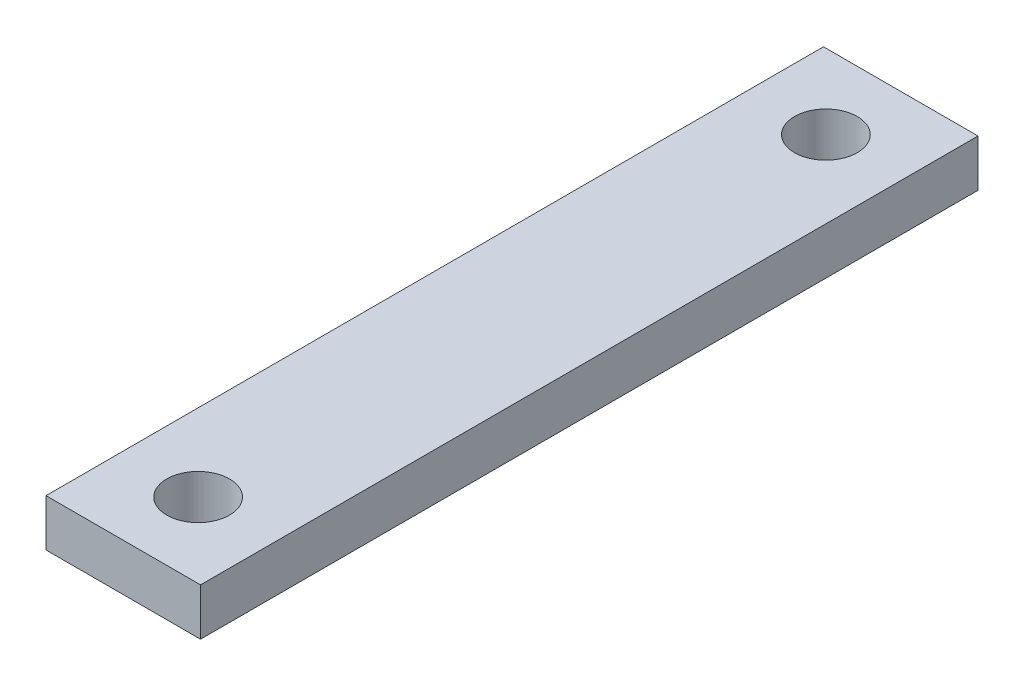
ISO-10303-21;
HEADER;
FILE_DESCRIPTION(('STEP AP214'),'2;1');
FILE_NAME('part.step','',(''),(''),'','','');
FILE_SCHEMA(('AUTOMOTIVE_DESIGN { 1 0 10303 214 1 1 1 1 }'));
ENDSEC;
DATA;
#1=APPLICATION_CONTEXT('core data for automotive mechanical design processes');
#2=APPLICATION_PROTOCOL_DEFINITION('international standard','automotive_design',2000,#1);
#3=PRODUCT_CONTEXT('',#1,'mechanical');
#4=PRODUCT('Part','Part','',(#3));
#5=PRODUCT_RELATED_PRODUCT_CATEGORY('part','',(#4));
#6=PRODUCT_DEFINITION_FORMATION('','',#4);
#7=PRODUCT_DEFINITION_CONTEXT('part definition',#1,'design');
#8=PRODUCT_DEFINITION('design','',#6,#7);
#9=PRODUCT_DEFINITION_SHAPE('','',#8);
#10=(LENGTH_UNIT() NAMED_UNIT(*) SI_UNIT(.MILLI.,.METRE.));
#11=(NAMED_UNIT(*) PLANE_ANGLE_UNIT() SI_UNIT($,.RADIAN.));
#12=(NAMED_UNIT(*) SI_UNIT($,.STERADIAN.) SOLID_ANGLE_UNIT());
#13=UNCERTAINTY_MEASURE_WITH_UNIT(LENGTH_MEASURE(1.E-05),#10,'distance_accuracy_value','');
#14=(GEOMETRIC_REPRESENTATION_CONTEXT(3) GLOBAL_UNCERTAINTY_ASSIGNED_CONTEXT((#13)) GLOBAL_UNIT_ASSIGNED_CONTEXT((#10,
#11,#12)) REPRESENTATION_CONTEXT('',''));
#15=CARTESIAN_POINT('',(0.,0.,0.));
#16=DIRECTION('',(0.,0.,1.));
#17=DIRECTION('',(1.,0.,0.));
#18=AXIS2_PLACEMENT_3D('',#15,#16,#17);
#19=CARTESIAN_POINT('',(0.,3.,24.7692307692308));
#20=DIRECTION('',(0.,0.,-1.));
#21=DIRECTION('',(-1.,0.,0.));
#22=AXIS2_PLACEMENT_3D('',#19,#20,#21);
#23=PLANE('',#22);
#24=DIRECTION('',(1.,0.,0.));
#25=VECTOR('',#24,1.);
#26=CARTESIAN_POINT('',(0.,0.,24.7692307692308));
#27=LINE('',#26,#25);
#28=CARTESIAN_POINT('',(-4.92307692307693,0.,24.7692307692308));
#29=VERTEX_POINT('',#28);
#30=CARTESIAN_POINT('',(4.92307692307693,0.,24.7692307692308));
#31=VERTEX_POINT('',#30);
#32=EDGE_CURVE('E103',#29,#31,#27,.T.);
#33=ORIENTED_EDGE('',*,*,#32,.T.);
#34=DIRECTION('',(0.,-1.,0.));
#35=VECTOR('',#34,1.);
#36=CARTESIAN_POINT('',(4.92307692307693,3.,24.7692307692308));
#37=LINE('',#36,#35);
#38=CARTESIAN_POINT('',(4.92307692307693,3.,24.7692307692308));
#39=VERTEX_POINT('',#38);
#40=EDGE_CURVE('E11',#39,#31,#37,.T.);
#41=ORIENTED_EDGE('',*,*,#40,.F.);
#42=DIRECTION('',(1.,0.,0.));
#43=VECTOR('',#42,1.);
#44=CARTESIAN_POINT('',(0.,3.,24.7692307692308));
#45=LINE('',#44,#43);
#46=CARTESIAN_POINT('',(-4.92307692307693,3.,24.7692307692308));
#47=VERTEX_POINT('',#46);
#48=EDGE_CURVE('E83',#47,#39,#45,.T.);
#49=ORIENTED_EDGE('',*,*,#48,.F.);
#50=DIRECTION('',(0.,-1.,0.));
#51=VECTOR('',#50,1.);
#52=CARTESIAN_POINT('',(-4.92307692307693,3.,24.7692307692308));
#53=LINE('',#52,#51);
#54=EDGE_CURVE('E50',#47,#29,#53,.T.);
#55=ORIENTED_EDGE('',*,*,#54,.T.);
#56=EDGE_LOOP('',(#33,#41,#49,#55));
#57=FACE_BOUND('',#56,.T.);
#58=ADVANCED_FACE('F33',(#57),#23,.F.);
#59=CARTESIAN_POINT('',(4.92307692307693,3.,0.));
#60=DIRECTION('',(-1.,0.,0.));
#61=DIRECTION('',(0.,0.,1.));
#62=AXIS2_PLACEMENT_3D('',#59,#60,#61);
#63=PLANE('',#62);
#64=DIRECTION('',(0.,0.,-1.));
#65=VECTOR('',#64,1.);
#66=CARTESIAN_POINT('',(4.92307692307693,0.,0.));
#67=LINE('',#66,#65);
#68=CARTESIAN_POINT('',(4.92307692307693,0.,-24.7692307692308));
#69=VERTEX_POINT('',#68);
#70=EDGE_CURVE('E88',#31,#69,#67,.T.);
#71=ORIENTED_EDGE('',*,*,#70,.T.);
#72=DIRECTION('',(0.,-1.,0.));
#73=VECTOR('',#72,1.);
#74=CARTESIAN_POINT('',(4.92307692307693,3.,-24.7692307692308));
#75=LINE('',#74,#73);
#76=CARTESIAN_POINT('',(4.92307692307693,3.,-24.7692307692308));
#77=VERTEX_POINT('',#76);
#78=EDGE_CURVE('E42',#77,#69,#75,.T.);
#79=ORIENTED_EDGE('',*,*,#78,.F.);
#80=DIRECTION('',(0.,0.,-1.));
#81=VECTOR('',#80,1.);
#82=CARTESIAN_POINT('',(4.92307692307693,3.,0.));
#83=LINE('',#82,#81);
#84=EDGE_CURVE('E75',#39,#77,#83,.T.);
#85=ORIENTED_EDGE('',*,*,#84,.F.);
#86=ORIENTED_EDGE('',*,*,#40,.T.);
#87=EDGE_LOOP('',(#71,#79,#85,#86));
#88=FACE_BOUND('',#87,.T.);
#89=ADVANCED_FACE('F87',(#88),#63,.F.);
#90=CARTESIAN_POINT('',(0.,3.,-24.7692307692308));
#91=DIRECTION('',(0.,0.,-1.));
#92=DIRECTION('',(-1.,0.,0.));
#93=AXIS2_PLACEMENT_3D('',#90,#91,#92);
#94=PLANE('',#93);
#95=DIRECTION('',(1.,0.,0.));
#96=VECTOR('',#95,1.);
#97=CARTESIAN_POINT('',(0.,0.,-24.7692307692308));
#98=LINE('',#97,#96);
#99=CARTESIAN_POINT('',(-4.92307692307693,0.,-24.7692307692308));
#100=VERTEX_POINT('',#99);
#101=EDGE_CURVE('E106',#100,#69,#98,.T.);
#102=ORIENTED_EDGE('',*,*,#101,.F.);
#103=DIRECTION('',(0.,-1.,0.));
#104=VECTOR('',#103,1.);
#105=CARTESIAN_POINT('',(-4.92307692307693,3.,-24.7692307692308));
#106=LINE('',#105,#104);
#107=CARTESIAN_POINT('',(-4.92307692307693,3.,-24.7692307692308));
#108=VERTEX_POINT('',#107);
#109=EDGE_CURVE('E64',#108,#100,#106,.T.);
#110=ORIENTED_EDGE('',*,*,#109,.F.);
#111=DIRECTION('',(1.,0.,0.));
#112=VECTOR('',#111,1.);
#113=CARTESIAN_POINT('',(0.,3.,-24.7692307692308));
#114=LINE('',#113,#112);
#115=EDGE_CURVE('E82',#108,#77,#114,.T.);
#116=ORIENTED_EDGE('',*,*,#115,.T.);
#117=ORIENTED_EDGE('',*,*,#78,.T.);
#118=EDGE_LOOP('',(#102,#110,#116,#117));
#119=FACE_BOUND('',#118,.T.);
#120=ADVANCED_FACE('F91',(#119),#94,.T.);
#121=CARTESIAN_POINT('',(0.,3.,20.));
#122=DIRECTION('',(0.,-1.,0.));
#123=DIRECTION('',(0.,0.,-1.));
#124=AXIS2_PLACEMENT_3D('',#121,#122,#123);
#125=CYLINDRICAL_SURFACE('',#124,2.);
#126=CARTESIAN_POINT('',(0.,3.,20.));
#127=DIRECTION('',(0.,1.,0.));
#128=DIRECTION('',(0.,0.,1.));
#129=AXIS2_PLACEMENT_3D('',#126,#127,#128);
#130=CIRCLE('',#129,2.);
#131=CARTESIAN_POINT('',(0.,3.,22.));
#132=VERTEX_POINT('',#131);
#133=EDGE_CURVE('E115',#132,#132,#130,.T.);
#134=ORIENTED_EDGE('',*,*,#133,.T.);
#135=EDGE_LOOP('',(#134));
#136=FACE_BOUND('',#135,.T.);
#137=CARTESIAN_POINT('',(0.,0.,20.));
#138=DIRECTION('',(0.,1.,0.));
#139=DIRECTION('',(0.,0.,1.));
#140=AXIS2_PLACEMENT_3D('',#137,#138,#139);
#141=CIRCLE('',#140,2.);
#142=CARTESIAN_POINT('',(0.,0.,22.));
#143=VERTEX_POINT('',#142);
#144=EDGE_CURVE('E100',#143,#143,#141,.T.);
#145=ORIENTED_EDGE('',*,*,#144,.F.);
#146=EDGE_LOOP('',(#145));
#147=FACE_BOUND('',#146,.T.);
#148=ADVANCED_FACE('F123',(#136,#147),#125,.F.);
#149=CARTESIAN_POINT('',(0.,3.,-20.));
#150=DIRECTION('',(0.,-1.,0.));
#151=DIRECTION('',(0.,0.,-1.));
#152=AXIS2_PLACEMENT_3D('',#149,#150,#151);
#153=CYLINDRICAL_SURFACE('',#152,2.);
#154=CARTESIAN_POINT('',(0.,3.,-20.));
#155=DIRECTION('',(0.,1.,0.));
#156=DIRECTION('',(0.,0.,1.));
#157=AXIS2_PLACEMENT_3D('',#154,#155,#156);
#158=CIRCLE('',#157,2.);
#159=CARTESIAN_POINT('',(0.,3.,-18.));
#160=VERTEX_POINT('',#159);
#161=EDGE_CURVE('E111',#160,#160,#158,.T.);
#162=ORIENTED_EDGE('',*,*,#161,.T.);
#163=EDGE_LOOP('',(#162));
#164=FACE_BOUND('',#163,.T.);
#165=CARTESIAN_POINT('',(0.,0.,-20.));
#166=DIRECTION('',(0.,1.,0.));
#167=DIRECTION('',(0.,0.,1.));
#168=AXIS2_PLACEMENT_3D('',#165,#166,#167);
#169=CIRCLE('',#168,2.);
#170=CARTESIAN_POINT('',(0.,0.,-18.));
#171=VERTEX_POINT('',#170);
#172=EDGE_CURVE('E97',#171,#171,#169,.T.);
#173=ORIENTED_EDGE('',*,*,#172,.F.);
#174=EDGE_LOOP('',(#173));
#175=FACE_BOUND('',#174,.T.);
#176=ADVANCED_FACE('F35',(#164,#175),#153,.F.);
#177=CARTESIAN_POINT('',(-4.92307692307693,3.,0.));
#178=DIRECTION('',(-1.,0.,0.));
#179=DIRECTION('',(0.,0.,1.));
#180=AXIS2_PLACEMENT_3D('',#177,#178,#179);
#181=PLANE('',#180);
#182=DIRECTION('',(0.,0.,-1.));
#183=VECTOR('',#182,1.);
#184=CARTESIAN_POINT('',(-4.92307692307693,0.,0.));
#185=LINE('',#184,#183);
#186=EDGE_CURVE('E108',#29,#100,#185,.T.);
#187=ORIENTED_EDGE('',*,*,#186,.F.);
#188=ORIENTED_EDGE('',*,*,#54,.F.);
#189=DIRECTION('',(0.,0.,-1.));
#190=VECTOR('',#189,1.);
#191=CARTESIAN_POINT('',(-4.92307692307693,3.,0.));
#192=LINE('',#191,#190);
#193=EDGE_CURVE('E92',#47,#108,#192,.T.);
#194=ORIENTED_EDGE('',*,*,#193,.T.);
#195=ORIENTED_EDGE('',*,*,#109,.T.);
#196=EDGE_LOOP('',(#187,#188,#194,#195));
#197=FACE_BOUND('',#196,.T.);
#198=ADVANCED_FACE('F128',(#197),#181,.T.);
#199=CARTESIAN_POINT('',(0.,3.,0.));
#200=DIRECTION('',(0.,1.,0.));
#201=DIRECTION('',(0.,0.,1.));
#202=AXIS2_PLACEMENT_3D('',#199,#200,#201);
#203=PLANE('',#202);
#204=ORIENTED_EDGE('',*,*,#161,.F.);
#205=EDGE_LOOP('',(#204));
#206=FACE_BOUND('',#205,.T.);
#207=ORIENTED_EDGE('',*,*,#133,.F.);
#208=EDGE_LOOP('',(#207));
#209=FACE_BOUND('',#208,.T.);
#210=ORIENTED_EDGE('',*,*,#48,.T.);
#211=ORIENTED_EDGE('',*,*,#84,.T.);
#212=ORIENTED_EDGE('',*,*,#115,.F.);
#213=ORIENTED_EDGE('',*,*,#193,.F.);
#214=EDGE_LOOP('',(#210,#211,#212,#213));
#215=FACE_BOUND('',#214,.T.);
#216=ADVANCED_FACE('F79',(#206,#209,#215),#203,.T.);
#217=CARTESIAN_POINT('',(0.,0.,0.));
#218=DIRECTION('',(0.,1.,0.));
#219=DIRECTION('',(0.,0.,1.));
#220=AXIS2_PLACEMENT_3D('',#217,#218,#219);
#221=PLANE('',#220);
#222=ORIENTED_EDGE('',*,*,#172,.T.);
#223=EDGE_LOOP('',(#222));
#224=FACE_BOUND('',#223,.T.);
#225=ORIENTED_EDGE('',*,*,#144,.T.);
#226=EDGE_LOOP('',(#225));
#227=FACE_BOUND('',#226,.T.);
#228=ORIENTED_EDGE('',*,*,#32,.F.);
#229=ORIENTED_EDGE('',*,*,#186,.T.);
#230=ORIENTED_EDGE('',*,*,#101,.T.);
#231=ORIENTED_EDGE('',*,*,#70,.F.);
#232=EDGE_LOOP('',(#228,#229,#230,#231));
#233=FACE_BOUND('',#232,.T.);
#234=ADVANCED_FACE('F127',(#224,#227,#233),#221,.F.);
#235=CLOSED_SHELL('',(#58,#89,#120,#148,#176,#198,#216,#234));
#236=MANIFOLD_SOLID_BREP('B2',#235);
#237=ADVANCED_BREP_SHAPE_REPRESENTATION('',(#18,#236),#14);
#238=SHAPE_DEFINITION_REPRESENTATION(#9,#237);
ENDSEC;
END-ISO-10303-21;
